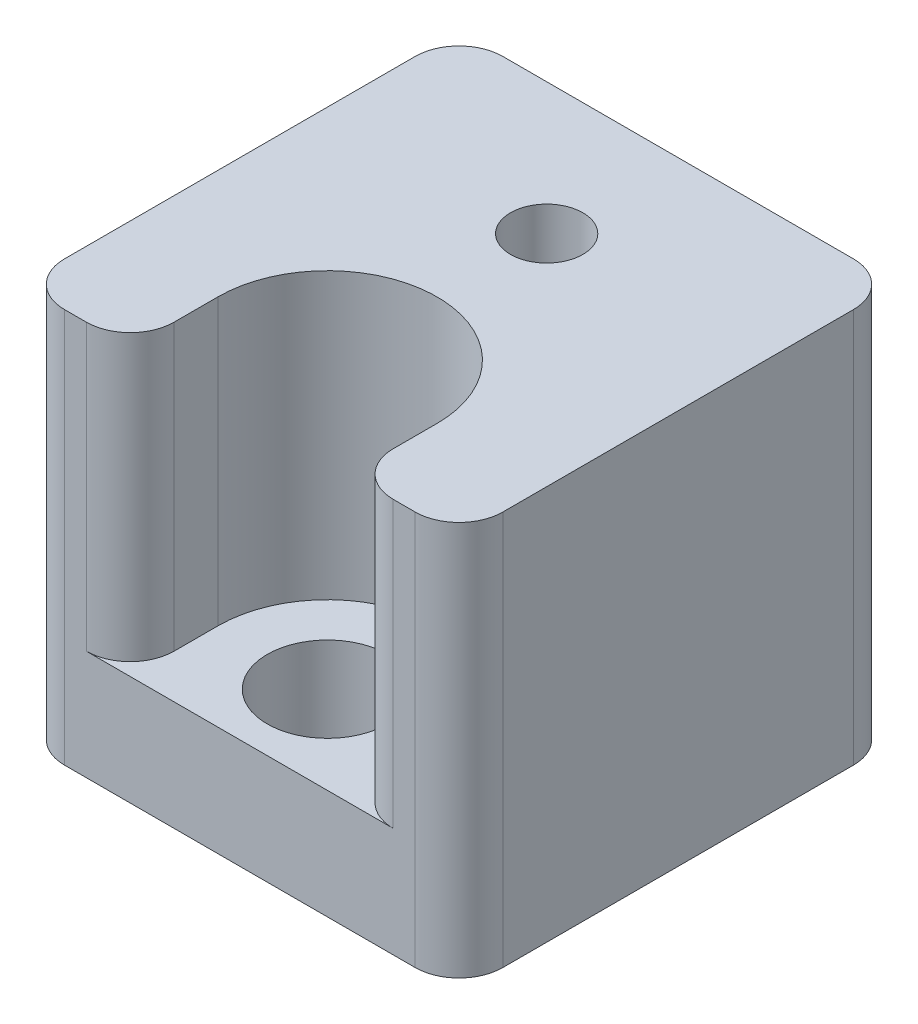
ISO-10303-21;
HEADER;
FILE_DESCRIPTION(('STEP AP214'),'2;1');
FILE_NAME('part.step','',(''),(''),'','','');
FILE_SCHEMA(('AUTOMOTIVE_DESIGN { 1 0 10303 214 1 1 1 1 }'));
ENDSEC;
DATA;
#1=APPLICATION_CONTEXT('core data for automotive mechanical design processes');
#2=APPLICATION_PROTOCOL_DEFINITION('international standard','automotive_design',2000,#1);
#3=PRODUCT_CONTEXT('',#1,'mechanical');
#4=PRODUCT('Part','Part','',(#3));
#5=PRODUCT_RELATED_PRODUCT_CATEGORY('part','',(#4));
#6=PRODUCT_DEFINITION_FORMATION('','',#4);
#7=PRODUCT_DEFINITION_CONTEXT('part definition',#1,'design');
#8=PRODUCT_DEFINITION('design','',#6,#7);
#9=PRODUCT_DEFINITION_SHAPE('','',#8);
#10=(LENGTH_UNIT() NAMED_UNIT(*) SI_UNIT(.MILLI.,.METRE.));
#11=(NAMED_UNIT(*) PLANE_ANGLE_UNIT() SI_UNIT($,.RADIAN.));
#12=(NAMED_UNIT(*) SI_UNIT($,.STERADIAN.) SOLID_ANGLE_UNIT());
#13=UNCERTAINTY_MEASURE_WITH_UNIT(LENGTH_MEASURE(1.E-05),#10,'distance_accuracy_value','');
#14=(GEOMETRIC_REPRESENTATION_CONTEXT(3) GLOBAL_UNCERTAINTY_ASSIGNED_CONTEXT((#13)) GLOBAL_UNIT_ASSIGNED_CONTEXT((#10,
#11,#12)) REPRESENTATION_CONTEXT('',''));
#15=CARTESIAN_POINT('',(0.,0.,0.));
#16=DIRECTION('',(0.,0.,1.));
#17=DIRECTION('',(1.,0.,0.));
#18=AXIS2_PLACEMENT_3D('',#15,#16,#17);
#19=CARTESIAN_POINT('',(-10.,9.,-6.));
#20=DIRECTION('',(-1.,0.,0.));
#21=DIRECTION('',(0.,-1.,0.));
#22=AXIS2_PLACEMENT_3D('',#19,#20,#21);
#23=PLANE('',#22);
#24=DIRECTION('',(0.,0.,1.));
#25=VECTOR('',#24,1.);
#26=CARTESIAN_POINT('',(-10.,9.,-6.));
#27=LINE('',#26,#25);
#28=CARTESIAN_POINT('',(-10.,9.,-4.));
#29=VERTEX_POINT('',#28);
#30=CARTESIAN_POINT('',(-10.,9.,12.));
#31=VERTEX_POINT('',#30);
#32=EDGE_CURVE('E188',#29,#31,#27,.T.);
#33=ORIENTED_EDGE('',*,*,#32,.F.);
#34=DIRECTION('',(0.,-1.,0.));
#35=VECTOR('',#34,1.);
#36=CARTESIAN_POINT('',(-10.,-9.,-4.));
#37=LINE('',#36,#35);
#38=CARTESIAN_POINT('',(-10.,-9.,-4.));
#39=VERTEX_POINT('',#38);
#40=EDGE_CURVE('E213',#29,#39,#37,.T.);
#41=ORIENTED_EDGE('',*,*,#40,.T.);
#42=DIRECTION('',(0.,0.,1.));
#43=VECTOR('',#42,1.);
#44=CARTESIAN_POINT('',(-10.,-9.,-6.));
#45=LINE('',#44,#43);
#46=CARTESIAN_POINT('',(-10.,-9.,12.));
#47=VERTEX_POINT('',#46);
#48=EDGE_CURVE('E187',#39,#47,#45,.T.);
#49=ORIENTED_EDGE('',*,*,#48,.T.);
#50=DIRECTION('',(0.,-1.,0.));
#51=VECTOR('',#50,1.);
#52=CARTESIAN_POINT('',(-10.,9.,12.));
#53=LINE('',#52,#51);
#54=EDGE_CURVE('E192',#47,#31,#53,.F.);
#55=ORIENTED_EDGE('',*,*,#54,.T.);
#56=EDGE_LOOP('',(#33,#41,#49,#55));
#57=FACE_BOUND('',#56,.T.);
#58=ADVANCED_FACE('F16',(#57),#23,.T.);
#59=CARTESIAN_POINT('',(-10.,9.,-6.));
#60=DIRECTION('',(0.,1.,0.));
#61=DIRECTION('',(0.,0.,1.));
#62=AXIS2_PLACEMENT_3D('',#59,#60,#61);
#63=PLANE('',#62);
#64=CARTESIAN_POINT('',(0.,9.,0.));
#65=DIRECTION('',(0.,1.,0.));
#66=DIRECTION('',(0.,0.,1.));
#67=AXIS2_PLACEMENT_3D('',#64,#65,#66);
#68=CIRCLE('',#67,1.65);
#69=CARTESIAN_POINT('',(0.,9.,1.65));
#70=VERTEX_POINT('',#69);
#71=EDGE_CURVE('E210',#70,#70,#68,.T.);
#72=ORIENTED_EDGE('',*,*,#71,.F.);
#73=EDGE_LOOP('',(#72));
#74=FACE_BOUND('',#73,.T.);
#75=DIRECTION('',(-1.,0.,0.));
#76=VECTOR('',#75,1.);
#77=CARTESIAN_POINT('',(-10.,9.,-6.));
#78=LINE('',#77,#76);
#79=CARTESIAN_POINT('',(8.,9.,-6.));
#80=VERTEX_POINT('',#79);
#81=CARTESIAN_POINT('',(-8.,9.,-6.));
#82=VERTEX_POINT('',#81);
#83=EDGE_CURVE('E184',#80,#82,#78,.T.);
#84=ORIENTED_EDGE('',*,*,#83,.T.);
#85=CARTESIAN_POINT('',(-8.,9.,-4.));
#86=DIRECTION('',(0.,1.,0.));
#87=DIRECTION('',(0.,0.,1.));
#88=AXIS2_PLACEMENT_3D('',#85,#86,#87);
#89=CIRCLE('',#88,2.);
#90=EDGE_CURVE('E249',#82,#29,#89,.T.);
#91=ORIENTED_EDGE('',*,*,#90,.T.);
#92=ORIENTED_EDGE('',*,*,#32,.T.);
#93=CARTESIAN_POINT('',(-8.,9.,12.));
#94=DIRECTION('',(0.,1.,0.));
#95=DIRECTION('',(0.,0.,1.));
#96=AXIS2_PLACEMENT_3D('',#93,#94,#95);
#97=CIRCLE('',#96,2.);
#98=CARTESIAN_POINT('',(-8.,9.,14.));
#99=VERTEX_POINT('',#98);
#100=EDGE_CURVE('E235',#31,#99,#97,.T.);
#101=ORIENTED_EDGE('',*,*,#100,.T.);
#102=DIRECTION('',(-1.,0.,0.));
#103=VECTOR('',#102,1.);
#104=CARTESIAN_POINT('',(-10.,9.,14.));
#105=LINE('',#104,#103);
#106=CARTESIAN_POINT('',(-7.,9.,14.));
#107=VERTEX_POINT('',#106);
#108=EDGE_CURVE('E175',#107,#99,#105,.T.);
#109=ORIENTED_EDGE('',*,*,#108,.F.);
#110=CARTESIAN_POINT('',(-7.,9.,12.));
#111=DIRECTION('',(0.,1.,0.));
#112=DIRECTION('',(0.,0.,1.));
#113=AXIS2_PLACEMENT_3D('',#110,#111,#112);
#114=CIRCLE('',#113,2.);
#115=CARTESIAN_POINT('',(-5.,9.,12.));
#116=VERTEX_POINT('',#115);
#117=EDGE_CURVE('E127',#107,#116,#114,.T.);
#118=ORIENTED_EDGE('',*,*,#117,.T.);
#119=DIRECTION('',(0.,0.,-1.));
#120=VECTOR('',#119,1.);
#121=CARTESIAN_POINT('',(-5.,9.,14.));
#122=LINE('',#121,#120);
#123=CARTESIAN_POINT('',(-5.,9.,10.));
#124=VERTEX_POINT('',#123);
#125=EDGE_CURVE('E118',#116,#124,#122,.T.);
#126=ORIENTED_EDGE('',*,*,#125,.T.);
#127=CARTESIAN_POINT('',(0.,9.,10.));
#128=DIRECTION('',(0.,-1.,0.));
#129=DIRECTION('',(0.,0.,-1.));
#130=AXIS2_PLACEMENT_3D('',#127,#128,#129);
#131=CIRCLE('',#130,5.);
#132=CARTESIAN_POINT('',(5.,9.,10.));
#133=VERTEX_POINT('',#132);
#134=EDGE_CURVE('E124',#124,#133,#131,.T.);
#135=ORIENTED_EDGE('',*,*,#134,.T.);
#136=DIRECTION('',(0.,0.,1.));
#137=VECTOR('',#136,1.);
#138=CARTESIAN_POINT('',(5.,9.,10.));
#139=LINE('',#138,#137);
#140=CARTESIAN_POINT('',(5.,9.,12.));
#141=VERTEX_POINT('',#140);
#142=EDGE_CURVE('E142',#133,#141,#139,.T.);
#143=ORIENTED_EDGE('',*,*,#142,.T.);
#144=CARTESIAN_POINT('',(7.,9.,12.));
#145=DIRECTION('',(0.,1.,0.));
#146=DIRECTION('',(0.,0.,1.));
#147=AXIS2_PLACEMENT_3D('',#144,#145,#146);
#148=CIRCLE('',#147,2.);
#149=CARTESIAN_POINT('',(7.,9.,14.));
#150=VERTEX_POINT('',#149);
#151=EDGE_CURVE('E240',#141,#150,#148,.T.);
#152=ORIENTED_EDGE('',*,*,#151,.T.);
#153=CARTESIAN_POINT('',(8.,9.,14.));
#154=VERTEX_POINT('',#153);
#155=EDGE_CURVE('E179',#154,#150,#105,.T.);
#156=ORIENTED_EDGE('',*,*,#155,.F.);
#157=CARTESIAN_POINT('',(8.,9.,12.));
#158=DIRECTION('',(0.,1.,0.));
#159=DIRECTION('',(0.,0.,1.));
#160=AXIS2_PLACEMENT_3D('',#157,#158,#159);
#161=CIRCLE('',#160,2.);
#162=CARTESIAN_POINT('',(10.,9.,12.));
#163=VERTEX_POINT('',#162);
#164=EDGE_CURVE('E243',#154,#163,#161,.T.);
#165=ORIENTED_EDGE('',*,*,#164,.T.);
#166=DIRECTION('',(0.,0.,1.));
#167=VECTOR('',#166,1.);
#168=CARTESIAN_POINT('',(10.,9.,-6.));
#169=LINE('',#168,#167);
#170=CARTESIAN_POINT('',(10.,9.,-4.));
#171=VERTEX_POINT('',#170);
#172=EDGE_CURVE('E193',#171,#163,#169,.T.);
#173=ORIENTED_EDGE('',*,*,#172,.F.);
#174=CARTESIAN_POINT('',(8.,9.,-4.));
#175=DIRECTION('',(0.,1.,0.));
#176=DIRECTION('',(0.,0.,1.));
#177=AXIS2_PLACEMENT_3D('',#174,#175,#176);
#178=CIRCLE('',#177,2.);
#179=EDGE_CURVE('E246',#171,#80,#178,.T.);
#180=ORIENTED_EDGE('',*,*,#179,.T.);
#181=EDGE_LOOP('',(#84,#91,#92,#101,#109,#118,#126,#135,#143,#152,#156,#165,#173,#180));
#182=FACE_BOUND('',#181,.T.);
#183=ADVANCED_FACE('F121',(#74,#182),#63,.T.);
#184=CARTESIAN_POINT('',(10.,9.,-6.));
#185=DIRECTION('',(1.,0.,0.));
#186=DIRECTION('',(0.,1.,0.));
#187=AXIS2_PLACEMENT_3D('',#184,#185,#186);
#188=PLANE('',#187);
#189=DIRECTION('',(0.,0.,1.));
#190=VECTOR('',#189,1.);
#191=CARTESIAN_POINT('',(10.,-9.,-6.));
#192=LINE('',#191,#190);
#193=CARTESIAN_POINT('',(10.,-9.,-4.));
#194=VERTEX_POINT('',#193);
#195=CARTESIAN_POINT('',(10.,-9.,12.));
#196=VERTEX_POINT('',#195);
#197=EDGE_CURVE('E197',#194,#196,#192,.T.);
#198=ORIENTED_EDGE('',*,*,#197,.F.);
#199=DIRECTION('',(0.,1.,0.));
#200=VECTOR('',#199,1.);
#201=CARTESIAN_POINT('',(10.,9.,-4.));
#202=LINE('',#201,#200);
#203=EDGE_CURVE('E255',#194,#171,#202,.T.);
#204=ORIENTED_EDGE('',*,*,#203,.T.);
#205=ORIENTED_EDGE('',*,*,#172,.T.);
#206=DIRECTION('',(0.,1.,0.));
#207=VECTOR('',#206,1.);
#208=CARTESIAN_POINT('',(10.,9.,12.));
#209=LINE('',#208,#207);
#210=EDGE_CURVE('E252',#163,#196,#209,.F.);
#211=ORIENTED_EDGE('',*,*,#210,.T.);
#212=EDGE_LOOP('',(#198,#204,#205,#211));
#213=FACE_BOUND('',#212,.T.);
#214=ADVANCED_FACE('F314',(#213),#188,.T.);
#215=CARTESIAN_POINT('',(-10.,-9.,-6.));
#216=DIRECTION('',(0.,-1.,0.));
#217=DIRECTION('',(0.,0.,-1.));
#218=AXIS2_PLACEMENT_3D('',#215,#216,#217);
#219=PLANE('',#218);
#220=CARTESIAN_POINT('',(0.,-9.,0.));
#221=DIRECTION('',(0.,-1.,0.));
#222=DIRECTION('',(0.,0.,-1.));
#223=AXIS2_PLACEMENT_3D('',#220,#221,#222);
#224=CIRCLE('',#223,1.65);
#225=CARTESIAN_POINT('',(0.,-9.,-1.65));
#226=VERTEX_POINT('',#225);
#227=EDGE_CURVE('E156',#226,#226,#224,.T.);
#228=ORIENTED_EDGE('',*,*,#227,.F.);
#229=EDGE_LOOP('',(#228));
#230=FACE_BOUND('',#229,.T.);
#231=CARTESIAN_POINT('',(0.,-9.,10.));
#232=DIRECTION('',(0.,-1.,0.));
#233=DIRECTION('',(0.,0.,-1.));
#234=AXIS2_PLACEMENT_3D('',#231,#232,#233);
#235=CIRCLE('',#234,2.75);
#236=CARTESIAN_POINT('',(0.,-9.,7.25));
#237=VERTEX_POINT('',#236);
#238=EDGE_CURVE('E167',#237,#237,#235,.T.);
#239=ORIENTED_EDGE('',*,*,#238,.F.);
#240=EDGE_LOOP('',(#239));
#241=FACE_BOUND('',#240,.T.);
#242=ORIENTED_EDGE('',*,*,#48,.F.);
#243=CARTESIAN_POINT('',(-8.,-9.,-4.));
#244=DIRECTION('',(0.,-1.,0.));
#245=DIRECTION('',(0.,0.,-1.));
#246=AXIS2_PLACEMENT_3D('',#243,#244,#245);
#247=CIRCLE('',#246,2.);
#248=CARTESIAN_POINT('',(-8.,-9.,-6.));
#249=VERTEX_POINT('',#248);
#250=EDGE_CURVE('E226',#39,#249,#247,.T.);
#251=ORIENTED_EDGE('',*,*,#250,.T.);
#252=DIRECTION('',(1.,0.,0.));
#253=VECTOR('',#252,1.);
#254=CARTESIAN_POINT('',(-10.,-9.,-6.));
#255=LINE('',#254,#253);
#256=CARTESIAN_POINT('',(8.,-9.,-6.));
#257=VERTEX_POINT('',#256);
#258=EDGE_CURVE('E180',#249,#257,#255,.T.);
#259=ORIENTED_EDGE('',*,*,#258,.T.);
#260=CARTESIAN_POINT('',(8.,-9.,-4.));
#261=DIRECTION('',(0.,-1.,0.));
#262=DIRECTION('',(0.,0.,-1.));
#263=AXIS2_PLACEMENT_3D('',#260,#261,#262);
#264=CIRCLE('',#263,2.);
#265=EDGE_CURVE('E223',#257,#194,#264,.T.);
#266=ORIENTED_EDGE('',*,*,#265,.T.);
#267=ORIENTED_EDGE('',*,*,#197,.T.);
#268=CARTESIAN_POINT('',(8.,-9.,12.));
#269=DIRECTION('',(0.,-1.,0.));
#270=DIRECTION('',(0.,0.,-1.));
#271=AXIS2_PLACEMENT_3D('',#268,#269,#270);
#272=CIRCLE('',#271,2.);
#273=CARTESIAN_POINT('',(8.,-9.,14.));
#274=VERTEX_POINT('',#273);
#275=EDGE_CURVE('E220',#196,#274,#272,.T.);
#276=ORIENTED_EDGE('',*,*,#275,.T.);
#277=DIRECTION('',(1.,0.,0.));
#278=VECTOR('',#277,1.);
#279=CARTESIAN_POINT('',(-10.,-9.,14.));
#280=LINE('',#279,#278);
#281=CARTESIAN_POINT('',(-8.,-9.,14.));
#282=VERTEX_POINT('',#281);
#283=EDGE_CURVE('E171',#282,#274,#280,.T.);
#284=ORIENTED_EDGE('',*,*,#283,.F.);
#285=CARTESIAN_POINT('',(-8.,-9.,12.));
#286=DIRECTION('',(0.,-1.,0.));
#287=DIRECTION('',(0.,0.,-1.));
#288=AXIS2_PLACEMENT_3D('',#285,#286,#287);
#289=CIRCLE('',#288,2.);
#290=EDGE_CURVE('E217',#282,#47,#289,.T.);
#291=ORIENTED_EDGE('',*,*,#290,.T.);
#292=EDGE_LOOP('',(#242,#251,#259,#266,#267,#276,#284,#291));
#293=FACE_BOUND('',#292,.T.);
#294=ADVANCED_FACE('F306',(#230,#241,#293),#219,.T.);
#295=CARTESIAN_POINT('',(0.,0.,-6.));
#296=DIRECTION('',(0.,0.,1.));
#297=DIRECTION('',(1.,0.,0.));
#298=AXIS2_PLACEMENT_3D('',#295,#296,#297);
#299=PLANE('',#298);
#300=ORIENTED_EDGE('',*,*,#258,.F.);
#301=DIRECTION('',(0.,-1.,0.));
#302=VECTOR('',#301,1.);
#303=CARTESIAN_POINT('',(-8.,9.,-6.));
#304=LINE('',#303,#302);
#305=EDGE_CURVE('E232',#249,#82,#304,.F.);
#306=ORIENTED_EDGE('',*,*,#305,.T.);
#307=ORIENTED_EDGE('',*,*,#83,.F.);
#308=DIRECTION('',(0.,1.,0.));
#309=VECTOR('',#308,1.);
#310=CARTESIAN_POINT('',(8.,-9.,-6.));
#311=LINE('',#310,#309);
#312=EDGE_CURVE('E229',#80,#257,#311,.F.);
#313=ORIENTED_EDGE('',*,*,#312,.T.);
#314=EDGE_LOOP('',(#300,#306,#307,#313));
#315=FACE_BOUND('',#314,.T.);
#316=ADVANCED_FACE('F324',(#315),#299,.F.);
#317=CARTESIAN_POINT('',(0.,0.,14.));
#318=DIRECTION('',(0.,0.,1.));
#319=DIRECTION('',(1.,0.,0.));
#320=AXIS2_PLACEMENT_3D('',#317,#318,#319);
#321=PLANE('',#320);
#322=ORIENTED_EDGE('',*,*,#283,.T.);
#323=DIRECTION('',(0.,1.,0.));
#324=VECTOR('',#323,1.);
#325=CARTESIAN_POINT('',(8.,0.,14.));
#326=LINE('',#325,#324);
#327=EDGE_CURVE('E270',#274,#154,#326,.T.);
#328=ORIENTED_EDGE('',*,*,#327,.T.);
#329=ORIENTED_EDGE('',*,*,#155,.T.);
#330=DIRECTION('',(0.,-1.,0.));
#331=VECTOR('',#330,1.);
#332=CARTESIAN_POINT('',(7.,-4.,14.));
#333=LINE('',#332,#331);
#334=CARTESIAN_POINT('',(7.,-4.,14.));
#335=VERTEX_POINT('',#334);
#336=EDGE_CURVE('E266',#150,#335,#333,.T.);
#337=ORIENTED_EDGE('',*,*,#336,.T.);
#338=DIRECTION('',(-1.,0.,0.));
#339=VECTOR('',#338,1.);
#340=CARTESIAN_POINT('',(5.,-4.,14.));
#341=LINE('',#340,#339);
#342=CARTESIAN_POINT('',(-7.,-4.,14.));
#343=VERTEX_POINT('',#342);
#344=EDGE_CURVE('E153',#335,#343,#341,.T.);
#345=ORIENTED_EDGE('',*,*,#344,.T.);
#346=DIRECTION('',(0.,-1.,0.));
#347=VECTOR('',#346,1.);
#348=CARTESIAN_POINT('',(-7.,9.,14.));
#349=LINE('',#348,#347);
#350=EDGE_CURVE('E263',#343,#107,#349,.F.);
#351=ORIENTED_EDGE('',*,*,#350,.T.);
#352=ORIENTED_EDGE('',*,*,#108,.T.);
#353=DIRECTION('',(0.,-1.,0.));
#354=VECTOR('',#353,1.);
#355=CARTESIAN_POINT('',(-8.,0.,14.));
#356=LINE('',#355,#354);
#357=EDGE_CURVE('E259',#99,#282,#356,.T.);
#358=ORIENTED_EDGE('',*,*,#357,.T.);
#359=EDGE_LOOP('',(#322,#328,#329,#337,#345,#351,#352,#358));
#360=FACE_BOUND('',#359,.T.);
#361=ADVANCED_FACE('F287',(#360),#321,.T.);
#362=CARTESIAN_POINT('',(0.,9.,10.));
#363=DIRECTION('',(0.,-1.,0.));
#364=DIRECTION('',(0.,0.,-1.));
#365=AXIS2_PLACEMENT_3D('',#362,#363,#364);
#366=CYLINDRICAL_SURFACE('',#365,2.75);
#367=CARTESIAN_POINT('',(0.,-4.,10.));
#368=DIRECTION('',(0.,-1.,0.));
#369=DIRECTION('',(0.,0.,-1.));
#370=AXIS2_PLACEMENT_3D('',#367,#368,#369);
#371=CIRCLE('',#370,2.75);
#372=CARTESIAN_POINT('',(0.,-4.,7.25));
#373=VERTEX_POINT('',#372);
#374=EDGE_CURVE('E165',#373,#373,#371,.F.);
#375=ORIENTED_EDGE('',*,*,#374,.T.);
#376=EDGE_LOOP('',(#375));
#377=FACE_BOUND('',#376,.T.);
#378=ORIENTED_EDGE('',*,*,#238,.T.);
#379=EDGE_LOOP('',(#378));
#380=FACE_BOUND('',#379,.T.);
#381=ADVANCED_FACE('F434',(#377,#380),#366,.F.);
#382=CARTESIAN_POINT('',(0.,-4.,10.));
#383=DIRECTION('',(0.,-1.,0.));
#384=DIRECTION('',(0.,0.,-1.));
#385=AXIS2_PLACEMENT_3D('',#382,#383,#384);
#386=PLANE('',#385);
#387=ORIENTED_EDGE('',*,*,#344,.F.);
#388=CARTESIAN_POINT('',(7.,-4.,12.));
#389=DIRECTION('',(0.,-1.,0.));
#390=DIRECTION('',(0.,0.,-1.));
#391=AXIS2_PLACEMENT_3D('',#388,#389,#390);
#392=CIRCLE('',#391,2.);
#393=CARTESIAN_POINT('',(5.,-4.,12.));
#394=VERTEX_POINT('',#393);
#395=EDGE_CURVE('E25',#335,#394,#392,.T.);
#396=ORIENTED_EDGE('',*,*,#395,.T.);
#397=DIRECTION('',(0.,0.,1.));
#398=VECTOR('',#397,1.);
#399=CARTESIAN_POINT('',(5.,-4.,10.));
#400=LINE('',#399,#398);
#401=CARTESIAN_POINT('',(5.,-4.,10.));
#402=VERTEX_POINT('',#401);
#403=EDGE_CURVE('E130',#402,#394,#400,.T.);
#404=ORIENTED_EDGE('',*,*,#403,.F.);
#405=CARTESIAN_POINT('',(0.,-4.,10.));
#406=DIRECTION('',(0.,-1.,0.));
#407=DIRECTION('',(0.,0.,-1.));
#408=AXIS2_PLACEMENT_3D('',#405,#406,#407);
#409=CIRCLE('',#408,5.);
#410=CARTESIAN_POINT('',(-5.,-4.,10.));
#411=VERTEX_POINT('',#410);
#412=EDGE_CURVE('E159',#411,#402,#409,.T.);
#413=ORIENTED_EDGE('',*,*,#412,.F.);
#414=DIRECTION('',(0.,0.,-1.));
#415=VECTOR('',#414,1.);
#416=CARTESIAN_POINT('',(-5.,-4.,14.));
#417=LINE('',#416,#415);
#418=CARTESIAN_POINT('',(-5.,-4.,12.));
#419=VERTEX_POINT('',#418);
#420=EDGE_CURVE('E136',#419,#411,#417,.T.);
#421=ORIENTED_EDGE('',*,*,#420,.F.);
#422=CARTESIAN_POINT('',(-7.,-4.,12.));
#423=DIRECTION('',(0.,-1.,0.));
#424=DIRECTION('',(0.,0.,-1.));
#425=AXIS2_PLACEMENT_3D('',#422,#423,#424);
#426=CIRCLE('',#425,2.);
#427=EDGE_CURVE('E11',#419,#343,#426,.T.);
#428=ORIENTED_EDGE('',*,*,#427,.T.);
#429=EDGE_LOOP('',(#387,#396,#404,#413,#421,#428));
#430=FACE_BOUND('',#429,.T.);
#431=ORIENTED_EDGE('',*,*,#374,.F.);
#432=EDGE_LOOP('',(#431));
#433=FACE_BOUND('',#432,.T.);
#434=ADVANCED_FACE('F295',(#430,#433),#386,.F.);
#435=CARTESIAN_POINT('',(5.,9.,10.));
#436=DIRECTION('',(1.,0.,0.));
#437=DIRECTION('',(0.,0.,-1.));
#438=AXIS2_PLACEMENT_3D('',#435,#436,#437);
#439=PLANE('',#438);
#440=ORIENTED_EDGE('',*,*,#403,.T.);
#441=DIRECTION('',(0.,-1.,0.));
#442=VECTOR('',#441,1.);
#443=CARTESIAN_POINT('',(5.,9.,12.));
#444=LINE('',#443,#442);
#445=EDGE_CURVE('E274',#394,#141,#444,.F.);
#446=ORIENTED_EDGE('',*,*,#445,.T.);
#447=ORIENTED_EDGE('',*,*,#142,.F.);
#448=DIRECTION('',(0.,-1.,0.));
#449=VECTOR('',#448,1.);
#450=CARTESIAN_POINT('',(5.,9.,10.));
#451=LINE('',#450,#449);
#452=EDGE_CURVE('E141',#133,#402,#451,.T.);
#453=ORIENTED_EDGE('',*,*,#452,.T.);
#454=EDGE_LOOP('',(#440,#446,#447,#453));
#455=FACE_BOUND('',#454,.T.);
#456=ADVANCED_FACE('F294',(#455),#439,.F.);
#457=CARTESIAN_POINT('',(0.,9.,10.));
#458=DIRECTION('',(0.,-1.,0.));
#459=DIRECTION('',(0.,0.,-1.));
#460=AXIS2_PLACEMENT_3D('',#457,#458,#459);
#461=CYLINDRICAL_SURFACE('',#460,5.);
#462=ORIENTED_EDGE('',*,*,#412,.T.);
#463=ORIENTED_EDGE('',*,*,#452,.F.);
#464=ORIENTED_EDGE('',*,*,#134,.F.);
#465=DIRECTION('',(0.,-1.,0.));
#466=VECTOR('',#465,1.);
#467=CARTESIAN_POINT('',(-5.,9.,10.));
#468=LINE('',#467,#466);
#469=EDGE_CURVE('E133',#124,#411,#468,.T.);
#470=ORIENTED_EDGE('',*,*,#469,.T.);
#471=EDGE_LOOP('',(#462,#463,#464,#470));
#472=FACE_BOUND('',#471,.T.);
#473=ADVANCED_FACE('F144',(#472),#461,.F.);
#474=CARTESIAN_POINT('',(-5.,9.,14.));
#475=DIRECTION('',(-1.,0.,0.));
#476=DIRECTION('',(0.,0.,1.));
#477=AXIS2_PLACEMENT_3D('',#474,#475,#476);
#478=PLANE('',#477);
#479=ORIENTED_EDGE('',*,*,#125,.F.);
#480=DIRECTION('',(0.,-1.,0.));
#481=VECTOR('',#480,1.);
#482=CARTESIAN_POINT('',(-5.,-4.,12.));
#483=LINE('',#482,#481);
#484=EDGE_CURVE('E277',#116,#419,#483,.T.);
#485=ORIENTED_EDGE('',*,*,#484,.T.);
#486=ORIENTED_EDGE('',*,*,#420,.T.);
#487=ORIENTED_EDGE('',*,*,#469,.F.);
#488=EDGE_LOOP('',(#479,#485,#486,#487));
#489=FACE_BOUND('',#488,.T.);
#490=ADVANCED_FACE('F134',(#489),#478,.F.);
#491=CARTESIAN_POINT('',(0.,9.,0.));
#492=DIRECTION('',(0.,1.,0.));
#493=DIRECTION('',(0.,0.,1.));
#494=AXIS2_PLACEMENT_3D('',#491,#492,#493);
#495=CYLINDRICAL_SURFACE('',#494,1.65);
#496=ORIENTED_EDGE('',*,*,#227,.T.);
#497=EDGE_LOOP('',(#496));
#498=FACE_BOUND('',#497,.T.);
#499=ORIENTED_EDGE('',*,*,#71,.T.);
#500=EDGE_LOOP('',(#499));
#501=FACE_BOUND('',#500,.T.);
#502=ADVANCED_FACE('F344',(#498,#501),#495,.F.);
#503=CARTESIAN_POINT('',(-8.,9.,-4.));
#504=DIRECTION('',(0.,1.,0.));
#505=DIRECTION('',(-1.,0.,0.));
#506=AXIS2_PLACEMENT_3D('',#503,#504,#505);
#507=CYLINDRICAL_SURFACE('',#506,2.);
#508=ORIENTED_EDGE('',*,*,#90,.F.);
#509=ORIENTED_EDGE('',*,*,#305,.F.);
#510=ORIENTED_EDGE('',*,*,#250,.F.);
#511=ORIENTED_EDGE('',*,*,#40,.F.);
#512=EDGE_LOOP('',(#508,#509,#510,#511));
#513=FACE_BOUND('',#512,.T.);
#514=ADVANCED_FACE('F327',(#513),#507,.T.);
#515=CARTESIAN_POINT('',(8.,9.,-4.));
#516=DIRECTION('',(0.,-1.,0.));
#517=DIRECTION('',(1.,0.,0.));
#518=AXIS2_PLACEMENT_3D('',#515,#516,#517);
#519=CYLINDRICAL_SURFACE('',#518,2.);
#520=ORIENTED_EDGE('',*,*,#265,.F.);
#521=ORIENTED_EDGE('',*,*,#312,.F.);
#522=ORIENTED_EDGE('',*,*,#179,.F.);
#523=ORIENTED_EDGE('',*,*,#203,.F.);
#524=EDGE_LOOP('',(#520,#521,#522,#523));
#525=FACE_BOUND('',#524,.T.);
#526=ADVANCED_FACE('F318',(#525),#519,.T.);
#527=CARTESIAN_POINT('',(8.,0.,12.));
#528=DIRECTION('',(0.,1.,0.));
#529=DIRECTION('',(-1.,0.,0.));
#530=AXIS2_PLACEMENT_3D('',#527,#528,#529);
#531=CYLINDRICAL_SURFACE('',#530,2.);
#532=ORIENTED_EDGE('',*,*,#275,.F.);
#533=ORIENTED_EDGE('',*,*,#210,.F.);
#534=ORIENTED_EDGE('',*,*,#164,.F.);
#535=ORIENTED_EDGE('',*,*,#327,.F.);
#536=EDGE_LOOP('',(#532,#533,#534,#535));
#537=FACE_BOUND('',#536,.T.);
#538=ADVANCED_FACE('F311',(#537),#531,.T.);
#539=CARTESIAN_POINT('',(7.,0.,12.));
#540=DIRECTION('',(0.,1.,0.));
#541=DIRECTION('',(0.,0.,1.));
#542=AXIS2_PLACEMENT_3D('',#539,#540,#541);
#543=CYLINDRICAL_SURFACE('',#542,2.);
#544=ORIENTED_EDGE('',*,*,#151,.F.);
#545=ORIENTED_EDGE('',*,*,#445,.F.);
#546=ORIENTED_EDGE('',*,*,#395,.F.);
#547=ORIENTED_EDGE('',*,*,#336,.F.);
#548=EDGE_LOOP('',(#544,#545,#546,#547));
#549=FACE_BOUND('',#548,.T.);
#550=ADVANCED_FACE('F291',(#549),#543,.T.);
#551=CARTESIAN_POINT('',(-7.,9.,12.));
#552=DIRECTION('',(0.,1.,0.));
#553=DIRECTION('',(0.,0.,1.));
#554=AXIS2_PLACEMENT_3D('',#551,#552,#553);
#555=CYLINDRICAL_SURFACE('',#554,2.);
#556=ORIENTED_EDGE('',*,*,#117,.F.);
#557=ORIENTED_EDGE('',*,*,#350,.F.);
#558=ORIENTED_EDGE('',*,*,#427,.F.);
#559=ORIENTED_EDGE('',*,*,#484,.F.);
#560=EDGE_LOOP('',(#556,#557,#558,#559));
#561=FACE_BOUND('',#560,.T.);
#562=ADVANCED_FACE('F297',(#561),#555,.T.);
#563=CARTESIAN_POINT('',(-8.,0.,12.));
#564=DIRECTION('',(0.,-1.,0.));
#565=DIRECTION('',(1.,0.,0.));
#566=AXIS2_PLACEMENT_3D('',#563,#564,#565);
#567=CYLINDRICAL_SURFACE('',#566,2.);
#568=ORIENTED_EDGE('',*,*,#100,.F.);
#569=ORIENTED_EDGE('',*,*,#54,.F.);
#570=ORIENTED_EDGE('',*,*,#290,.F.);
#571=ORIENTED_EDGE('',*,*,#357,.F.);
#572=EDGE_LOOP('',(#568,#569,#570,#571));
#573=FACE_BOUND('',#572,.T.);
#574=ADVANCED_FACE('F18',(#573),#567,.T.);
#575=CLOSED_SHELL('',(#58,#183,#214,#294,#316,#361,#381,#434,#456,#473,#490,#502,#514,#526,#538,
#550,#562,#574));
#576=MANIFOLD_SOLID_BREP('B1',#575);
#577=ADVANCED_BREP_SHAPE_REPRESENTATION('',(#18,#576),#14);
#578=SHAPE_DEFINITION_REPRESENTATION(#9,#577);
ENDSEC;
END-ISO-10303-21;
